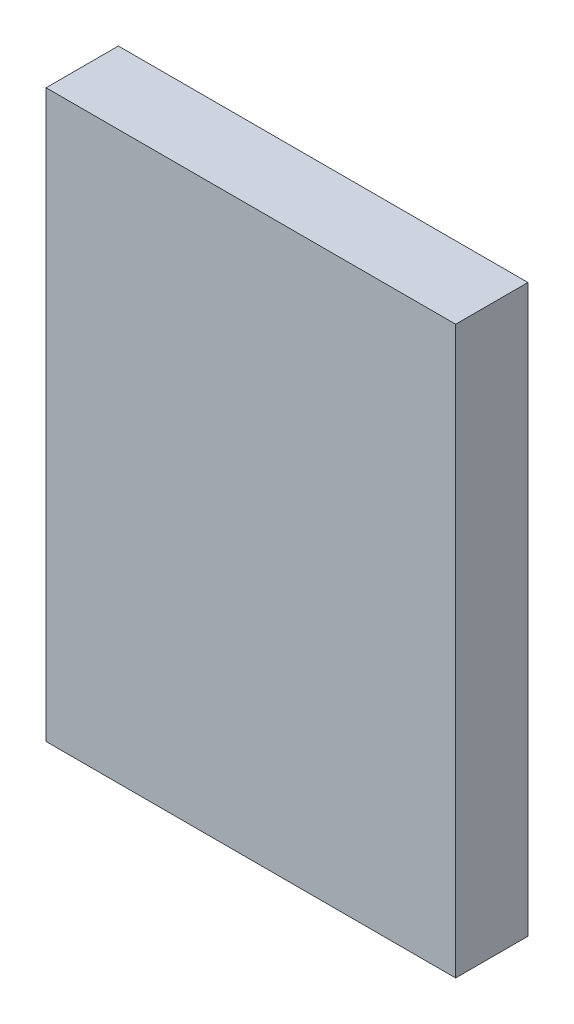
ISO-10303-21;
HEADER;
FILE_DESCRIPTION(('STEP AP214'),'2;1');
FILE_NAME('part.step','',(''),(''),'','','');
FILE_SCHEMA(('AUTOMOTIVE_DESIGN { 1 0 10303 214 1 1 1 1 }'));
ENDSEC;
DATA;
#1=APPLICATION_CONTEXT('core data for automotive mechanical design processes');
#2=APPLICATION_PROTOCOL_DEFINITION('international standard','automotive_design',2000,#1);
#3=PRODUCT_CONTEXT('',#1,'mechanical');
#4=PRODUCT('Part','Part','',(#3));
#5=PRODUCT_RELATED_PRODUCT_CATEGORY('part','',(#4));
#6=PRODUCT_DEFINITION_FORMATION('','',#4);
#7=PRODUCT_DEFINITION_CONTEXT('part definition',#1,'design');
#8=PRODUCT_DEFINITION('design','',#6,#7);
#9=PRODUCT_DEFINITION_SHAPE('','',#8);
#10=(LENGTH_UNIT() NAMED_UNIT(*) SI_UNIT(.MILLI.,.METRE.));
#11=(NAMED_UNIT(*) PLANE_ANGLE_UNIT() SI_UNIT($,.RADIAN.));
#12=(NAMED_UNIT(*) SI_UNIT($,.STERADIAN.) SOLID_ANGLE_UNIT());
#13=UNCERTAINTY_MEASURE_WITH_UNIT(LENGTH_MEASURE(1.E-05),#10,'distance_accuracy_value','');
#14=(GEOMETRIC_REPRESENTATION_CONTEXT(3) GLOBAL_UNCERTAINTY_ASSIGNED_CONTEXT((#13)) GLOBAL_UNIT_ASSIGNED_CONTEXT((#10,
#11,#12)) REPRESENTATION_CONTEXT('',''));
#15=CARTESIAN_POINT('',(0.,0.,0.));
#16=DIRECTION('',(0.,0.,1.));
#17=DIRECTION('',(1.,0.,0.));
#18=AXIS2_PLACEMENT_3D('',#15,#16,#17);
#19=CARTESIAN_POINT('',(1.70000168,2.35000038,0.6));
#20=DIRECTION('',(0.,0.,-1.));
#21=DIRECTION('',(-1.,0.,0.));
#22=AXIS2_PLACEMENT_3D('',#19,#20,#21);
#23=PLANE('',#22);
#24=DIRECTION('',(0.,1.,0.));
#25=VECTOR('',#24,1.);
#26=CARTESIAN_POINT('',(-1.69999914,2.35000038,0.6));
#27=LINE('',#26,#25);
#28=CARTESIAN_POINT('',(-1.69999914,2.35000038,0.6));
#29=VERTEX_POINT('',#28);
#30=CARTESIAN_POINT('',(-1.69999914,-2.35000038,0.6));
#31=VERTEX_POINT('',#30);
#32=EDGE_CURVE('E79',#29,#31,#27,.F.);
#33=ORIENTED_EDGE('',*,*,#32,.T.);
#34=DIRECTION('',(1.,0.,0.));
#35=VECTOR('',#34,1.);
#36=CARTESIAN_POINT('',(-1.69999914,-2.35000038,0.6));
#37=LINE('',#36,#35);
#38=CARTESIAN_POINT('',(1.70000168,-2.35000038,0.6));
#39=VERTEX_POINT('',#38);
#40=EDGE_CURVE('E55',#31,#39,#37,.T.);
#41=ORIENTED_EDGE('',*,*,#40,.T.);
#42=DIRECTION('',(0.,1.,0.));
#43=VECTOR('',#42,1.);
#44=CARTESIAN_POINT('',(1.70000168,-2.35000038,0.6));
#45=LINE('',#44,#43);
#46=CARTESIAN_POINT('',(1.70000168,2.35000038,0.6));
#47=VERTEX_POINT('',#46);
#48=EDGE_CURVE('E57',#39,#47,#45,.T.);
#49=ORIENTED_EDGE('',*,*,#48,.T.);
#50=DIRECTION('',(1.,0.,0.));
#51=VECTOR('',#50,1.);
#52=CARTESIAN_POINT('',(1.70000168,2.35000038,0.6));
#53=LINE('',#52,#51);
#54=EDGE_CURVE('E20',#47,#29,#53,.F.);
#55=ORIENTED_EDGE('',*,*,#54,.T.);
#56=EDGE_LOOP('',(#33,#41,#49,#55));
#57=FACE_BOUND('',#56,.T.);
#58=ADVANCED_FACE('F17',(#57),#23,.F.);
#59=CARTESIAN_POINT('',(1.70000168,2.35000038,0.));
#60=DIRECTION('',(0.,-1.,0.));
#61=DIRECTION('',(0.,0.,-1.));
#62=AXIS2_PLACEMENT_3D('',#59,#60,#61);
#63=PLANE('',#62);
#64=DIRECTION('',(-1.,0.,0.));
#65=VECTOR('',#64,1.);
#66=CARTESIAN_POINT('',(1.70000168,2.35000038,0.));
#67=LINE('',#66,#65);
#68=CARTESIAN_POINT('',(-1.69999914,2.35000038,0.));
#69=VERTEX_POINT('',#68);
#70=CARTESIAN_POINT('',(1.70000168,2.35000038,0.));
#71=VERTEX_POINT('',#70);
#72=EDGE_CURVE('E83',#69,#71,#67,.F.);
#73=ORIENTED_EDGE('',*,*,#72,.F.);
#74=DIRECTION('',(0.,0.,-1.));
#75=VECTOR('',#74,1.);
#76=CARTESIAN_POINT('',(-1.69999914,2.35000038,0.));
#77=LINE('',#76,#75);
#78=EDGE_CURVE('E68',#69,#29,#77,.F.);
#79=ORIENTED_EDGE('',*,*,#78,.T.);
#80=ORIENTED_EDGE('',*,*,#54,.F.);
#81=DIRECTION('',(0.,0.,1.));
#82=VECTOR('',#81,1.);
#83=CARTESIAN_POINT('',(1.70000168,2.35000038,0.));
#84=LINE('',#83,#82);
#85=EDGE_CURVE('E63',#47,#71,#84,.F.);
#86=ORIENTED_EDGE('',*,*,#85,.T.);
#87=EDGE_LOOP('',(#73,#79,#80,#86));
#88=FACE_BOUND('',#87,.T.);
#89=ADVANCED_FACE('F65',(#88),#63,.F.);
#90=CARTESIAN_POINT('',(1.70000168,-2.35000038,0.));
#91=DIRECTION('',(-1.,0.,0.));
#92=DIRECTION('',(0.,0.,1.));
#93=AXIS2_PLACEMENT_3D('',#90,#91,#92);
#94=PLANE('',#93);
#95=DIRECTION('',(0.,1.,0.));
#96=VECTOR('',#95,1.);
#97=CARTESIAN_POINT('',(1.70000168,2.35000038,0.));
#98=LINE('',#97,#96);
#99=CARTESIAN_POINT('',(1.70000168,-2.35000038,0.));
#100=VERTEX_POINT('',#99);
#101=EDGE_CURVE('E72',#71,#100,#98,.F.);
#102=ORIENTED_EDGE('',*,*,#101,.F.);
#103=ORIENTED_EDGE('',*,*,#85,.F.);
#104=ORIENTED_EDGE('',*,*,#48,.F.);
#105=DIRECTION('',(0.,0.,1.));
#106=VECTOR('',#105,1.);
#107=CARTESIAN_POINT('',(1.70000168,-2.35000038,0.));
#108=LINE('',#107,#106);
#109=EDGE_CURVE('E75',#39,#100,#108,.F.);
#110=ORIENTED_EDGE('',*,*,#109,.T.);
#111=EDGE_LOOP('',(#102,#103,#104,#110));
#112=FACE_BOUND('',#111,.T.);
#113=ADVANCED_FACE('F70',(#112),#94,.F.);
#114=CARTESIAN_POINT('',(-1.69999914,-2.35000038,0.));
#115=DIRECTION('',(0.,1.,0.));
#116=DIRECTION('',(0.,0.,1.));
#117=AXIS2_PLACEMENT_3D('',#114,#115,#116);
#118=PLANE('',#117);
#119=DIRECTION('',(-1.,0.,0.));
#120=VECTOR('',#119,1.);
#121=CARTESIAN_POINT('',(1.70000168,-2.35000038,0.));
#122=LINE('',#121,#120);
#123=CARTESIAN_POINT('',(-1.69999914,-2.35000038,0.));
#124=VERTEX_POINT('',#123);
#125=EDGE_CURVE('E26',#100,#124,#122,.T.);
#126=ORIENTED_EDGE('',*,*,#125,.F.);
#127=ORIENTED_EDGE('',*,*,#109,.F.);
#128=ORIENTED_EDGE('',*,*,#40,.F.);
#129=DIRECTION('',(0.,0.,-1.));
#130=VECTOR('',#129,1.);
#131=CARTESIAN_POINT('',(-1.69999914,-2.35000038,0.));
#132=LINE('',#131,#130);
#133=EDGE_CURVE('E35',#31,#124,#132,.T.);
#134=ORIENTED_EDGE('',*,*,#133,.T.);
#135=EDGE_LOOP('',(#126,#127,#128,#134));
#136=FACE_BOUND('',#135,.T.);
#137=ADVANCED_FACE('F89',(#136),#118,.F.);
#138=CARTESIAN_POINT('',(-1.69999914,2.35000038,0.));
#139=DIRECTION('',(1.,0.,0.));
#140=DIRECTION('',(0.,0.,-1.));
#141=AXIS2_PLACEMENT_3D('',#138,#139,#140);
#142=PLANE('',#141);
#143=DIRECTION('',(0.,1.,0.));
#144=VECTOR('',#143,1.);
#145=CARTESIAN_POINT('',(-1.69999914,2.35000038,0.));
#146=LINE('',#145,#144);
#147=EDGE_CURVE('E11',#124,#69,#146,.T.);
#148=ORIENTED_EDGE('',*,*,#147,.F.);
#149=ORIENTED_EDGE('',*,*,#133,.F.);
#150=ORIENTED_EDGE('',*,*,#32,.F.);
#151=ORIENTED_EDGE('',*,*,#78,.F.);
#152=EDGE_LOOP('',(#148,#149,#150,#151));
#153=FACE_BOUND('',#152,.T.);
#154=ADVANCED_FACE('F91',(#153),#142,.F.);
#155=CARTESIAN_POINT('',(1.70000168,2.35000038,0.));
#156=DIRECTION('',(0.,0.,-1.));
#157=DIRECTION('',(-1.,0.,0.));
#158=AXIS2_PLACEMENT_3D('',#155,#156,#157);
#159=PLANE('',#158);
#160=ORIENTED_EDGE('',*,*,#125,.T.);
#161=ORIENTED_EDGE('',*,*,#147,.T.);
#162=ORIENTED_EDGE('',*,*,#72,.T.);
#163=ORIENTED_EDGE('',*,*,#101,.T.);
#164=EDGE_LOOP('',(#160,#161,#162,#163));
#165=FACE_BOUND('',#164,.T.);
#166=ADVANCED_FACE('F88',(#165),#159,.T.);
#167=CLOSED_SHELL('',(#58,#89,#113,#137,#154,#166));
#168=MANIFOLD_SOLID_BREP('B1',#167);
#169=ADVANCED_BREP_SHAPE_REPRESENTATION('',(#18,#168),#14);
#170=SHAPE_DEFINITION_REPRESENTATION(#9,#169);
ENDSEC;
END-ISO-10303-21;
